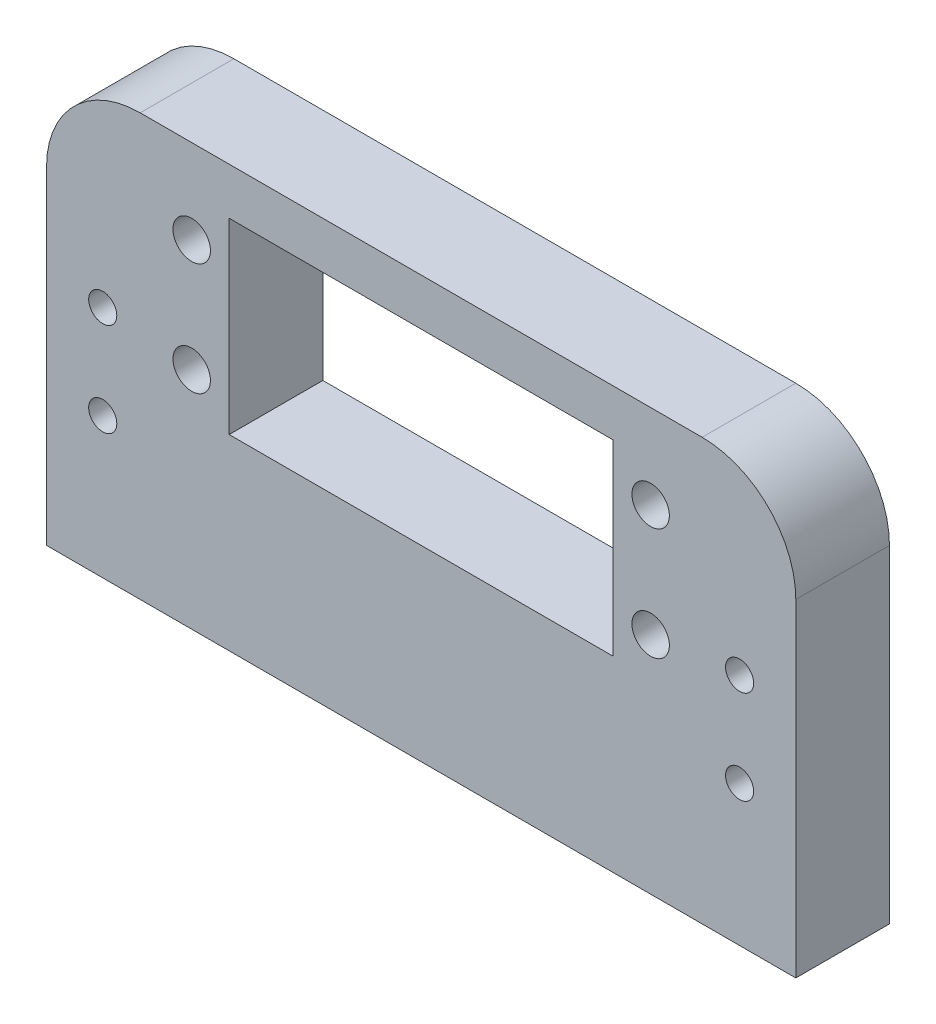
ISO-10303-21;
HEADER;
FILE_DESCRIPTION(('STEP AP214'),'2;1');
FILE_NAME('part.step','',(''),(''),'','','');
FILE_SCHEMA(('AUTOMOTIVE_DESIGN { 1 0 10303 214 1 1 1 1 }'));
ENDSEC;
DATA;
#1=APPLICATION_CONTEXT('core data for automotive mechanical design processes');
#2=APPLICATION_PROTOCOL_DEFINITION('international standard','automotive_design',2000,#1);
#3=PRODUCT_CONTEXT('',#1,'mechanical');
#4=PRODUCT('Part','Part','',(#3));
#5=PRODUCT_RELATED_PRODUCT_CATEGORY('part','',(#4));
#6=PRODUCT_DEFINITION_FORMATION('','',#4);
#7=PRODUCT_DEFINITION_CONTEXT('part definition',#1,'design');
#8=PRODUCT_DEFINITION('design','',#6,#7);
#9=PRODUCT_DEFINITION_SHAPE('','',#8);
#10=(LENGTH_UNIT() NAMED_UNIT(*) SI_UNIT(.MILLI.,.METRE.));
#11=(NAMED_UNIT(*) PLANE_ANGLE_UNIT() SI_UNIT($,.RADIAN.));
#12=(NAMED_UNIT(*) SI_UNIT($,.STERADIAN.) SOLID_ANGLE_UNIT());
#13=UNCERTAINTY_MEASURE_WITH_UNIT(LENGTH_MEASURE(1.E-05),#10,'distance_accuracy_value','');
#14=(GEOMETRIC_REPRESENTATION_CONTEXT(3) GLOBAL_UNCERTAINTY_ASSIGNED_CONTEXT((#13)) GLOBAL_UNIT_ASSIGNED_CONTEXT((#10,
#11,#12)) REPRESENTATION_CONTEXT('',''));
#15=CARTESIAN_POINT('',(0.,0.,0.));
#16=DIRECTION('',(0.,0.,1.));
#17=DIRECTION('',(1.,0.,0.));
#18=AXIS2_PLACEMENT_3D('',#15,#16,#17);
#19=CARTESIAN_POINT('',(-15.5364806866953,19.5708154506438,10.));
#20=DIRECTION('',(0.,0.,1.));
#21=DIRECTION('',(1.,0.,0.));
#22=AXIS2_PLACEMENT_3D('',#19,#20,#21);
#23=PLANE('',#22);
#24=CARTESIAN_POINT('',(48.4635193133047,9.57081545064378,10.));
#25=DIRECTION('',(0.,0.,1.));
#26=DIRECTION('',(-1.,0.,0.));
#27=AXIS2_PLACEMENT_3D('',#24,#25,#26);
#28=CIRCLE('',#27,1.5);
#29=CARTESIAN_POINT('',(46.9635193133047,9.57081545064378,10.));
#30=VERTEX_POINT('',#29);
#31=EDGE_CURVE('E288',#30,#30,#28,.T.);
#32=ORIENTED_EDGE('',*,*,#31,.F.);
#33=EDGE_LOOP('',(#32));
#34=FACE_BOUND('',#33,.T.);
#35=CARTESIAN_POINT('',(-19.5364806866953,-0.429184549356233,10.));
#36=DIRECTION('',(0.,0.,1.));
#37=DIRECTION('',(1.,0.,0.));
#38=AXIS2_PLACEMENT_3D('',#35,#36,#37);
#39=CIRCLE('',#38,1.5);
#40=CARTESIAN_POINT('',(-18.0364806866953,-0.429184549356233,10.));
#41=VERTEX_POINT('',#40);
#42=EDGE_CURVE('E300',#41,#41,#39,.T.);
#43=ORIENTED_EDGE('',*,*,#42,.F.);
#44=EDGE_LOOP('',(#43));
#45=FACE_BOUND('',#44,.T.);
#46=CARTESIAN_POINT('',(-10.0364806866953,8.57081545064376,10.));
#47=DIRECTION('',(0.,0.,1.));
#48=DIRECTION('',(-1.,0.,0.));
#49=AXIS2_PLACEMENT_3D('',#46,#47,#48);
#50=CIRCLE('',#49,2.);
#51=CARTESIAN_POINT('',(-12.0364806866953,8.57081545064376,10.));
#52=VERTEX_POINT('',#51);
#53=EDGE_CURVE('E312',#52,#52,#50,.T.);
#54=ORIENTED_EDGE('',*,*,#53,.F.);
#55=EDGE_LOOP('',(#54));
#56=FACE_BOUND('',#55,.T.);
#57=CARTESIAN_POINT('',(-10.0364806866953,20.5708154506438,10.));
#58=DIRECTION('',(0.,0.,1.));
#59=DIRECTION('',(1.,0.,0.));
#60=AXIS2_PLACEMENT_3D('',#57,#58,#59);
#61=CIRCLE('',#60,2.);
#62=CARTESIAN_POINT('',(-8.03648068669527,20.5708154506438,10.));
#63=VERTEX_POINT('',#62);
#64=EDGE_CURVE('E138',#63,#63,#61,.T.);
#65=ORIENTED_EDGE('',*,*,#64,.F.);
#66=EDGE_LOOP('',(#65));
#67=FACE_BOUND('',#66,.T.);
#68=DIRECTION('',(0.,1.,0.));
#69=VECTOR('',#68,1.);
#70=CARTESIAN_POINT('',(54.4635193133047,19.5708154506437,10.));
#71=LINE('',#70,#69);
#72=CARTESIAN_POINT('',(54.4635193133047,-15.4291845493562,10.));
#73=VERTEX_POINT('',#72);
#74=CARTESIAN_POINT('',(54.4635193133047,19.5708154506437,10.));
#75=VERTEX_POINT('',#74);
#76=EDGE_CURVE('E148',#73,#75,#71,.T.);
#77=ORIENTED_EDGE('',*,*,#76,.T.);
#78=CARTESIAN_POINT('',(44.4635193133047,19.5708154506438,10.));
#79=DIRECTION('',(0.,0.,1.));
#80=DIRECTION('',(1.,0.,0.));
#81=AXIS2_PLACEMENT_3D('',#78,#79,#80);
#82=CIRCLE('',#81,10.);
#83=CARTESIAN_POINT('',(44.4635193133047,29.5708154506438,10.));
#84=VERTEX_POINT('',#83);
#85=EDGE_CURVE('E151',#75,#84,#82,.T.);
#86=ORIENTED_EDGE('',*,*,#85,.T.);
#87=DIRECTION('',(-1.,0.,0.));
#88=VECTOR('',#87,1.);
#89=CARTESIAN_POINT('',(-15.5364806866952,29.5708154506438,10.));
#90=LINE('',#89,#88);
#91=CARTESIAN_POINT('',(-15.5364806866952,29.5708154506438,10.));
#92=VERTEX_POINT('',#91);
#93=EDGE_CURVE('E154',#84,#92,#90,.T.);
#94=ORIENTED_EDGE('',*,*,#93,.T.);
#95=CARTESIAN_POINT('',(-15.5364806866953,19.5708154506438,10.));
#96=DIRECTION('',(0.,0.,1.));
#97=DIRECTION('',(1.,0.,0.));
#98=AXIS2_PLACEMENT_3D('',#95,#96,#97);
#99=CIRCLE('',#98,10.);
#100=CARTESIAN_POINT('',(-25.5364806866953,19.5708154506437,10.));
#101=VERTEX_POINT('',#100);
#102=EDGE_CURVE('E156',#92,#101,#99,.T.);
#103=ORIENTED_EDGE('',*,*,#102,.T.);
#104=DIRECTION('',(0.,-1.,0.));
#105=VECTOR('',#104,1.);
#106=CARTESIAN_POINT('',(-25.5364806866953,19.5708154506437,10.));
#107=LINE('',#106,#105);
#108=CARTESIAN_POINT('',(-25.5364806866953,-15.4291845493562,10.));
#109=VERTEX_POINT('',#108);
#110=EDGE_CURVE('E158',#101,#109,#107,.T.);
#111=ORIENTED_EDGE('',*,*,#110,.T.);
#112=DIRECTION('',(1.,0.,0.));
#113=VECTOR('',#112,1.);
#114=CARTESIAN_POINT('',(-25.5364806866953,-15.4291845493562,10.));
#115=LINE('',#114,#113);
#116=EDGE_CURVE('E160',#109,#73,#115,.T.);
#117=ORIENTED_EDGE('',*,*,#116,.T.);
#118=EDGE_LOOP('',(#77,#86,#94,#103,#111,#117));
#119=FACE_BOUND('',#118,.T.);
#120=DIRECTION('',(1.,0.,0.));
#121=VECTOR('',#120,1.);
#122=CARTESIAN_POINT('',(-6.03648068669527,4.57081545064377,10.));
#123=LINE('',#122,#121);
#124=CARTESIAN_POINT('',(-6.03648068669527,4.57081545064377,10.));
#125=VERTEX_POINT('',#124);
#126=CARTESIAN_POINT('',(34.9635193133047,4.57081545064377,10.));
#127=VERTEX_POINT('',#126);
#128=EDGE_CURVE('E117',#125,#127,#123,.T.);
#129=ORIENTED_EDGE('',*,*,#128,.F.);
#130=DIRECTION('',(0.,-1.,0.));
#131=VECTOR('',#130,1.);
#132=CARTESIAN_POINT('',(-6.03648068669527,24.5708154506438,10.));
#133=LINE('',#132,#131);
#134=CARTESIAN_POINT('',(-6.03648068669527,24.5708154506438,10.));
#135=VERTEX_POINT('',#134);
#136=EDGE_CURVE('E109',#135,#125,#133,.T.);
#137=ORIENTED_EDGE('',*,*,#136,.F.);
#138=DIRECTION('',(-1.,0.,0.));
#139=VECTOR('',#138,1.);
#140=CARTESIAN_POINT('',(-6.03648068669527,24.5708154506438,10.));
#141=LINE('',#140,#139);
#142=CARTESIAN_POINT('',(34.9635193133047,24.5708154506438,10.));
#143=VERTEX_POINT('',#142);
#144=EDGE_CURVE('E132',#143,#135,#141,.T.);
#145=ORIENTED_EDGE('',*,*,#144,.F.);
#146=DIRECTION('',(0.,1.,0.));
#147=VECTOR('',#146,1.);
#148=CARTESIAN_POINT('',(34.9635193133047,24.5708154506438,10.));
#149=LINE('',#148,#147);
#150=EDGE_CURVE('E130',#127,#143,#149,.T.);
#151=ORIENTED_EDGE('',*,*,#150,.F.);
#152=EDGE_LOOP('',(#129,#137,#145,#151));
#153=FACE_BOUND('',#152,.T.);
#154=CARTESIAN_POINT('',(38.9635193133047,8.57081545064376,10.));
#155=DIRECTION('',(0.,0.,1.));
#156=DIRECTION('',(1.,0.,0.));
#157=AXIS2_PLACEMENT_3D('',#154,#155,#156);
#158=CIRCLE('',#157,2.);
#159=CARTESIAN_POINT('',(40.9635193133047,8.57081545064376,10.));
#160=VERTEX_POINT('',#159);
#161=EDGE_CURVE('E318',#160,#160,#158,.T.);
#162=ORIENTED_EDGE('',*,*,#161,.F.);
#163=EDGE_LOOP('',(#162));
#164=FACE_BOUND('',#163,.T.);
#165=CARTESIAN_POINT('',(38.9635193133047,20.5708154506438,10.));
#166=DIRECTION('',(0.,0.,1.));
#167=DIRECTION('',(-1.,0.,0.));
#168=AXIS2_PLACEMENT_3D('',#165,#166,#167);
#169=CIRCLE('',#168,2.);
#170=CARTESIAN_POINT('',(36.9635193133048,20.5708154506438,10.));
#171=VERTEX_POINT('',#170);
#172=EDGE_CURVE('E306',#171,#171,#169,.T.);
#173=ORIENTED_EDGE('',*,*,#172,.F.);
#174=EDGE_LOOP('',(#173));
#175=FACE_BOUND('',#174,.T.);
#176=CARTESIAN_POINT('',(-19.5364806866953,9.57081545064377,10.));
#177=DIRECTION('',(0.,0.,1.));
#178=DIRECTION('',(1.,0.,0.));
#179=AXIS2_PLACEMENT_3D('',#176,#177,#178);
#180=CIRCLE('',#179,1.5);
#181=CARTESIAN_POINT('',(-18.0364806866953,9.57081545064377,10.));
#182=VERTEX_POINT('',#181);
#183=EDGE_CURVE('E294',#182,#182,#180,.T.);
#184=ORIENTED_EDGE('',*,*,#183,.F.);
#185=EDGE_LOOP('',(#184));
#186=FACE_BOUND('',#185,.T.);
#187=CARTESIAN_POINT('',(48.4635193133048,-0.429184549356225,10.));
#188=DIRECTION('',(0.,0.,1.));
#189=DIRECTION('',(-1.,0.,0.));
#190=AXIS2_PLACEMENT_3D('',#187,#188,#189);
#191=CIRCLE('',#190,1.5);
#192=CARTESIAN_POINT('',(46.9635193133048,-0.429184549356225,10.));
#193=VERTEX_POINT('',#192);
#194=EDGE_CURVE('E279',#193,#193,#191,.T.);
#195=ORIENTED_EDGE('',*,*,#194,.F.);
#196=EDGE_LOOP('',(#195));
#197=FACE_BOUND('',#196,.T.);
#198=ADVANCED_FACE('F32',(#34,#45,#56,#67,#119,#153,#164,#175,#186,#197),#23,.T.);
#199=CARTESIAN_POINT('',(-15.5364806866953,19.5708154506438,0.));
#200=DIRECTION('',(0.,0.,1.));
#201=DIRECTION('',(1.,0.,0.));
#202=AXIS2_PLACEMENT_3D('',#199,#200,#201);
#203=PLANE('',#202);
#204=DIRECTION('',(0.,1.,0.));
#205=VECTOR('',#204,1.);
#206=CARTESIAN_POINT('',(54.4635193133047,19.5708154506437,0.));
#207=LINE('',#206,#205);
#208=CARTESIAN_POINT('',(54.4635193133047,-15.4291845493562,0.));
#209=VERTEX_POINT('',#208);
#210=CARTESIAN_POINT('',(54.4635193133047,19.5708154506437,0.));
#211=VERTEX_POINT('',#210);
#212=EDGE_CURVE('E125',#209,#211,#207,.T.);
#213=ORIENTED_EDGE('',*,*,#212,.F.);
#214=DIRECTION('',(1.,0.,0.));
#215=VECTOR('',#214,1.);
#216=CARTESIAN_POINT('',(-25.5364806866953,-15.4291845493562,0.));
#217=LINE('',#216,#215);
#218=CARTESIAN_POINT('',(-25.5364806866953,-15.4291845493562,0.));
#219=VERTEX_POINT('',#218);
#220=EDGE_CURVE('E152',#219,#209,#217,.T.);
#221=ORIENTED_EDGE('',*,*,#220,.F.);
#222=DIRECTION('',(0.,-1.,0.));
#223=VECTOR('',#222,1.);
#224=CARTESIAN_POINT('',(-25.5364806866953,19.5708154506437,0.));
#225=LINE('',#224,#223);
#226=CARTESIAN_POINT('',(-25.5364806866953,19.5708154506437,0.));
#227=VERTEX_POINT('',#226);
#228=EDGE_CURVE('E171',#227,#219,#225,.T.);
#229=ORIENTED_EDGE('',*,*,#228,.F.);
#230=CARTESIAN_POINT('',(-15.5364806866953,19.5708154506438,0.));
#231=DIRECTION('',(0.,0.,1.));
#232=DIRECTION('',(1.,0.,0.));
#233=AXIS2_PLACEMENT_3D('',#230,#231,#232);
#234=CIRCLE('',#233,10.);
#235=CARTESIAN_POINT('',(-15.5364806866952,29.5708154506438,0.));
#236=VERTEX_POINT('',#235);
#237=EDGE_CURVE('E169',#236,#227,#234,.T.);
#238=ORIENTED_EDGE('',*,*,#237,.F.);
#239=DIRECTION('',(-1.,0.,0.));
#240=VECTOR('',#239,1.);
#241=CARTESIAN_POINT('',(-15.5364806866952,29.5708154506438,0.));
#242=LINE('',#241,#240);
#243=CARTESIAN_POINT('',(44.4635193133047,29.5708154506438,0.));
#244=VERTEX_POINT('',#243);
#245=EDGE_CURVE('E167',#244,#236,#242,.T.);
#246=ORIENTED_EDGE('',*,*,#245,.F.);
#247=CARTESIAN_POINT('',(44.4635193133047,19.5708154506438,0.));
#248=DIRECTION('',(0.,0.,1.));
#249=DIRECTION('',(1.,0.,0.));
#250=AXIS2_PLACEMENT_3D('',#247,#248,#249);
#251=CIRCLE('',#250,10.);
#252=EDGE_CURVE('E165',#211,#244,#251,.T.);
#253=ORIENTED_EDGE('',*,*,#252,.F.);
#254=EDGE_LOOP('',(#213,#221,#229,#238,#246,#253));
#255=FACE_BOUND('',#254,.T.);
#256=DIRECTION('',(0.,-1.,0.));
#257=VECTOR('',#256,1.);
#258=CARTESIAN_POINT('',(-6.03648068669527,24.5708154506438,0.));
#259=LINE('',#258,#257);
#260=CARTESIAN_POINT('',(-6.03648068669527,24.5708154506438,0.));
#261=VERTEX_POINT('',#260);
#262=CARTESIAN_POINT('',(-6.03648068669527,4.57081545064377,0.));
#263=VERTEX_POINT('',#262);
#264=EDGE_CURVE('E55',#261,#263,#259,.T.);
#265=ORIENTED_EDGE('',*,*,#264,.T.);
#266=DIRECTION('',(1.,0.,0.));
#267=VECTOR('',#266,1.);
#268=CARTESIAN_POINT('',(-6.03648068669527,4.57081545064377,0.));
#269=LINE('',#268,#267);
#270=CARTESIAN_POINT('',(34.9635193133047,4.57081545064377,0.));
#271=VERTEX_POINT('',#270);
#272=EDGE_CURVE('E124',#263,#271,#269,.T.);
#273=ORIENTED_EDGE('',*,*,#272,.T.);
#274=DIRECTION('',(0.,1.,0.));
#275=VECTOR('',#274,1.);
#276=CARTESIAN_POINT('',(34.9635193133047,24.5708154506438,0.));
#277=LINE('',#276,#275);
#278=CARTESIAN_POINT('',(34.9635193133047,24.5708154506438,0.));
#279=VERTEX_POINT('',#278);
#280=EDGE_CURVE('E140',#271,#279,#277,.T.);
#281=ORIENTED_EDGE('',*,*,#280,.T.);
#282=DIRECTION('',(-1.,0.,0.));
#283=VECTOR('',#282,1.);
#284=CARTESIAN_POINT('',(-6.03648068669527,24.5708154506438,0.));
#285=LINE('',#284,#283);
#286=EDGE_CURVE('E118',#279,#261,#285,.T.);
#287=ORIENTED_EDGE('',*,*,#286,.T.);
#288=EDGE_LOOP('',(#265,#273,#281,#287));
#289=FACE_BOUND('',#288,.T.);
#290=CARTESIAN_POINT('',(-10.0364806866953,20.5708154506438,0.));
#291=DIRECTION('',(0.,0.,1.));
#292=DIRECTION('',(1.,0.,0.));
#293=AXIS2_PLACEMENT_3D('',#290,#291,#292);
#294=CIRCLE('',#293,2.);
#295=CARTESIAN_POINT('',(-8.03648068669527,20.5708154506438,0.));
#296=VERTEX_POINT('',#295);
#297=EDGE_CURVE('E321',#296,#296,#294,.T.);
#298=ORIENTED_EDGE('',*,*,#297,.T.);
#299=EDGE_LOOP('',(#298));
#300=FACE_BOUND('',#299,.T.);
#301=CARTESIAN_POINT('',(38.9635193133047,8.57081545064376,0.));
#302=DIRECTION('',(0.,0.,1.));
#303=DIRECTION('',(1.,0.,0.));
#304=AXIS2_PLACEMENT_3D('',#301,#302,#303);
#305=CIRCLE('',#304,2.);
#306=CARTESIAN_POINT('',(40.9635193133047,8.57081545064376,0.));
#307=VERTEX_POINT('',#306);
#308=EDGE_CURVE('E315',#307,#307,#305,.T.);
#309=ORIENTED_EDGE('',*,*,#308,.T.);
#310=EDGE_LOOP('',(#309));
#311=FACE_BOUND('',#310,.T.);
#312=CARTESIAN_POINT('',(-10.0364806866953,8.57081545064376,0.));
#313=DIRECTION('',(0.,0.,1.));
#314=DIRECTION('',(-1.,0.,0.));
#315=AXIS2_PLACEMENT_3D('',#312,#313,#314);
#316=CIRCLE('',#315,2.);
#317=CARTESIAN_POINT('',(-12.0364806866953,8.57081545064376,0.));
#318=VERTEX_POINT('',#317);
#319=EDGE_CURVE('E309',#318,#318,#316,.T.);
#320=ORIENTED_EDGE('',*,*,#319,.T.);
#321=EDGE_LOOP('',(#320));
#322=FACE_BOUND('',#321,.T.);
#323=CARTESIAN_POINT('',(38.9635193133047,20.5708154506438,0.));
#324=DIRECTION('',(0.,0.,1.));
#325=DIRECTION('',(-1.,0.,0.));
#326=AXIS2_PLACEMENT_3D('',#323,#324,#325);
#327=CIRCLE('',#326,2.);
#328=CARTESIAN_POINT('',(36.9635193133048,20.5708154506438,0.));
#329=VERTEX_POINT('',#328);
#330=EDGE_CURVE('E303',#329,#329,#327,.T.);
#331=ORIENTED_EDGE('',*,*,#330,.T.);
#332=EDGE_LOOP('',(#331));
#333=FACE_BOUND('',#332,.T.);
#334=CARTESIAN_POINT('',(-19.5364806866953,-0.429184549356233,0.));
#335=DIRECTION('',(0.,0.,1.));
#336=DIRECTION('',(1.,0.,0.));
#337=AXIS2_PLACEMENT_3D('',#334,#335,#336);
#338=CIRCLE('',#337,1.5);
#339=CARTESIAN_POINT('',(-18.0364806866953,-0.429184549356233,0.));
#340=VERTEX_POINT('',#339);
#341=EDGE_CURVE('E297',#340,#340,#338,.T.);
#342=ORIENTED_EDGE('',*,*,#341,.T.);
#343=EDGE_LOOP('',(#342));
#344=FACE_BOUND('',#343,.T.);
#345=CARTESIAN_POINT('',(-19.5364806866953,9.57081545064377,0.));
#346=DIRECTION('',(0.,0.,1.));
#347=DIRECTION('',(1.,0.,0.));
#348=AXIS2_PLACEMENT_3D('',#345,#346,#347);
#349=CIRCLE('',#348,1.5);
#350=CARTESIAN_POINT('',(-18.0364806866953,9.57081545064377,0.));
#351=VERTEX_POINT('',#350);
#352=EDGE_CURVE('E291',#351,#351,#349,.T.);
#353=ORIENTED_EDGE('',*,*,#352,.T.);
#354=EDGE_LOOP('',(#353));
#355=FACE_BOUND('',#354,.T.);
#356=CARTESIAN_POINT('',(48.4635193133047,9.57081545064378,0.));
#357=DIRECTION('',(0.,0.,1.));
#358=DIRECTION('',(-1.,0.,0.));
#359=AXIS2_PLACEMENT_3D('',#356,#357,#358);
#360=CIRCLE('',#359,1.5);
#361=CARTESIAN_POINT('',(46.9635193133047,9.57081545064378,0.));
#362=VERTEX_POINT('',#361);
#363=EDGE_CURVE('E285',#362,#362,#360,.T.);
#364=ORIENTED_EDGE('',*,*,#363,.T.);
#365=EDGE_LOOP('',(#364));
#366=FACE_BOUND('',#365,.T.);
#367=CARTESIAN_POINT('',(48.4635193133048,-0.429184549356225,0.));
#368=DIRECTION('',(0.,0.,1.));
#369=DIRECTION('',(-1.,0.,0.));
#370=AXIS2_PLACEMENT_3D('',#367,#368,#369);
#371=CIRCLE('',#370,1.5);
#372=CARTESIAN_POINT('',(46.9635193133048,-0.429184549356225,0.));
#373=VERTEX_POINT('',#372);
#374=EDGE_CURVE('E282',#373,#373,#371,.T.);
#375=ORIENTED_EDGE('',*,*,#374,.T.);
#376=EDGE_LOOP('',(#375));
#377=FACE_BOUND('',#376,.T.);
#378=ADVANCED_FACE('F195',(#255,#289,#300,#311,#322,#333,#344,#355,#366,#377),#203,.F.);
#379=CARTESIAN_POINT('',(54.4635193133047,19.5708154506437,10.));
#380=DIRECTION('',(-1.,0.,0.));
#381=DIRECTION('',(0.,-1.,0.));
#382=AXIS2_PLACEMENT_3D('',#379,#380,#381);
#383=PLANE('',#382);
#384=ORIENTED_EDGE('',*,*,#212,.T.);
#385=DIRECTION('',(0.,0.,-1.));
#386=VECTOR('',#385,1.);
#387=CARTESIAN_POINT('',(54.4635193133047,19.5708154506437,10.));
#388=LINE('',#387,#386);
#389=EDGE_CURVE('E11',#75,#211,#388,.T.);
#390=ORIENTED_EDGE('',*,*,#389,.F.);
#391=ORIENTED_EDGE('',*,*,#76,.F.);
#392=DIRECTION('',(0.,0.,-1.));
#393=VECTOR('',#392,1.);
#394=CARTESIAN_POINT('',(54.4635193133047,-15.4291845493562,10.));
#395=LINE('',#394,#393);
#396=EDGE_CURVE('E162',#73,#209,#395,.T.);
#397=ORIENTED_EDGE('',*,*,#396,.T.);
#398=EDGE_LOOP('',(#384,#390,#391,#397));
#399=FACE_BOUND('',#398,.T.);
#400=ADVANCED_FACE('F34',(#399),#383,.F.);
#401=CARTESIAN_POINT('',(44.4635193133047,19.5708154506438,10.));
#402=DIRECTION('',(0.,0.,-1.));
#403=DIRECTION('',(-1.,0.,0.));
#404=AXIS2_PLACEMENT_3D('',#401,#402,#403);
#405=CYLINDRICAL_SURFACE('',#404,10.);
#406=ORIENTED_EDGE('',*,*,#252,.T.);
#407=DIRECTION('',(0.,0.,-1.));
#408=VECTOR('',#407,1.);
#409=CARTESIAN_POINT('',(44.4635193133047,29.5708154506438,10.));
#410=LINE('',#409,#408);
#411=EDGE_CURVE('E40',#84,#244,#410,.T.);
#412=ORIENTED_EDGE('',*,*,#411,.F.);
#413=ORIENTED_EDGE('',*,*,#85,.F.);
#414=ORIENTED_EDGE('',*,*,#389,.T.);
#415=EDGE_LOOP('',(#406,#412,#413,#414));
#416=FACE_BOUND('',#415,.T.);
#417=ADVANCED_FACE('F212',(#416),#405,.T.);
#418=CARTESIAN_POINT('',(-15.5364806866952,29.5708154506438,10.));
#419=DIRECTION('',(0.,-1.,0.));
#420=DIRECTION('',(1.,0.,0.));
#421=AXIS2_PLACEMENT_3D('',#418,#419,#420);
#422=PLANE('',#421);
#423=ORIENTED_EDGE('',*,*,#245,.T.);
#424=DIRECTION('',(0.,0.,-1.));
#425=VECTOR('',#424,1.);
#426=CARTESIAN_POINT('',(-15.5364806866952,29.5708154506438,10.));
#427=LINE('',#426,#425);
#428=EDGE_CURVE('E182',#92,#236,#427,.T.);
#429=ORIENTED_EDGE('',*,*,#428,.F.);
#430=ORIENTED_EDGE('',*,*,#93,.F.);
#431=ORIENTED_EDGE('',*,*,#411,.T.);
#432=EDGE_LOOP('',(#423,#429,#430,#431));
#433=FACE_BOUND('',#432,.T.);
#434=ADVANCED_FACE('F189',(#433),#422,.F.);
#435=CARTESIAN_POINT('',(-15.5364806866953,19.5708154506438,10.));
#436=DIRECTION('',(0.,0.,-1.));
#437=DIRECTION('',(-1.,0.,0.));
#438=AXIS2_PLACEMENT_3D('',#435,#436,#437);
#439=CYLINDRICAL_SURFACE('',#438,10.);
#440=ORIENTED_EDGE('',*,*,#237,.T.);
#441=DIRECTION('',(0.,0.,-1.));
#442=VECTOR('',#441,1.);
#443=CARTESIAN_POINT('',(-25.5364806866953,19.5708154506437,10.));
#444=LINE('',#443,#442);
#445=EDGE_CURVE('E179',#101,#227,#444,.T.);
#446=ORIENTED_EDGE('',*,*,#445,.F.);
#447=ORIENTED_EDGE('',*,*,#102,.F.);
#448=ORIENTED_EDGE('',*,*,#428,.T.);
#449=EDGE_LOOP('',(#440,#446,#447,#448));
#450=FACE_BOUND('',#449,.T.);
#451=ADVANCED_FACE('F201',(#450),#439,.T.);
#452=CARTESIAN_POINT('',(-25.5364806866953,19.5708154506437,10.));
#453=DIRECTION('',(1.,0.,0.));
#454=DIRECTION('',(0.,0.,-1.));
#455=AXIS2_PLACEMENT_3D('',#452,#453,#454);
#456=PLANE('',#455);
#457=ORIENTED_EDGE('',*,*,#228,.T.);
#458=DIRECTION('',(0.,0.,-1.));
#459=VECTOR('',#458,1.);
#460=CARTESIAN_POINT('',(-25.5364806866953,-15.4291845493562,10.));
#461=LINE('',#460,#459);
#462=EDGE_CURVE('E176',#109,#219,#461,.T.);
#463=ORIENTED_EDGE('',*,*,#462,.F.);
#464=ORIENTED_EDGE('',*,*,#110,.F.);
#465=ORIENTED_EDGE('',*,*,#445,.T.);
#466=EDGE_LOOP('',(#457,#463,#464,#465));
#467=FACE_BOUND('',#466,.T.);
#468=ADVANCED_FACE('F205',(#467),#456,.F.);
#469=CARTESIAN_POINT('',(-25.5364806866953,-15.4291845493562,10.));
#470=DIRECTION('',(0.,1.,0.));
#471=DIRECTION('',(0.,0.,1.));
#472=AXIS2_PLACEMENT_3D('',#469,#470,#471);
#473=PLANE('',#472);
#474=ORIENTED_EDGE('',*,*,#220,.T.);
#475=ORIENTED_EDGE('',*,*,#396,.F.);
#476=ORIENTED_EDGE('',*,*,#116,.F.);
#477=ORIENTED_EDGE('',*,*,#462,.T.);
#478=EDGE_LOOP('',(#474,#475,#476,#477));
#479=FACE_BOUND('',#478,.T.);
#480=ADVANCED_FACE('F215',(#479),#473,.F.);
#481=CARTESIAN_POINT('',(-6.03648068669527,24.5708154506438,10.));
#482=DIRECTION('',(1.,0.,0.));
#483=DIRECTION('',(0.,1.,0.));
#484=AXIS2_PLACEMENT_3D('',#481,#482,#483);
#485=PLANE('',#484);
#486=ORIENTED_EDGE('',*,*,#264,.F.);
#487=DIRECTION('',(0.,0.,-1.));
#488=VECTOR('',#487,1.);
#489=CARTESIAN_POINT('',(-6.03648068669527,24.5708154506438,10.));
#490=LINE('',#489,#488);
#491=EDGE_CURVE('E113',#135,#261,#490,.T.);
#492=ORIENTED_EDGE('',*,*,#491,.F.);
#493=ORIENTED_EDGE('',*,*,#136,.T.);
#494=DIRECTION('',(0.,0.,-1.));
#495=VECTOR('',#494,1.);
#496=CARTESIAN_POINT('',(-6.03648068669527,4.57081545064377,10.));
#497=LINE('',#496,#495);
#498=EDGE_CURVE('E112',#125,#263,#497,.T.);
#499=ORIENTED_EDGE('',*,*,#498,.T.);
#500=EDGE_LOOP('',(#486,#492,#493,#499));
#501=FACE_BOUND('',#500,.T.);
#502=ADVANCED_FACE('F111',(#501),#485,.T.);
#503=CARTESIAN_POINT('',(-6.03648068669527,4.57081545064377,10.));
#504=DIRECTION('',(0.,1.,0.));
#505=DIRECTION('',(0.,0.,1.));
#506=AXIS2_PLACEMENT_3D('',#503,#504,#505);
#507=PLANE('',#506);
#508=ORIENTED_EDGE('',*,*,#272,.F.);
#509=ORIENTED_EDGE('',*,*,#498,.F.);
#510=ORIENTED_EDGE('',*,*,#128,.T.);
#511=DIRECTION('',(0.,0.,-1.));
#512=VECTOR('',#511,1.);
#513=CARTESIAN_POINT('',(34.9635193133047,4.57081545064377,10.));
#514=LINE('',#513,#512);
#515=EDGE_CURVE('E126',#127,#271,#514,.T.);
#516=ORIENTED_EDGE('',*,*,#515,.T.);
#517=EDGE_LOOP('',(#508,#509,#510,#516));
#518=FACE_BOUND('',#517,.T.);
#519=ADVANCED_FACE('F121',(#518),#507,.T.);
#520=CARTESIAN_POINT('',(34.9635193133047,24.5708154506438,10.));
#521=DIRECTION('',(-1.,0.,0.));
#522=DIRECTION('',(0.,0.,1.));
#523=AXIS2_PLACEMENT_3D('',#520,#521,#522);
#524=PLANE('',#523);
#525=ORIENTED_EDGE('',*,*,#280,.F.);
#526=ORIENTED_EDGE('',*,*,#515,.F.);
#527=ORIENTED_EDGE('',*,*,#150,.T.);
#528=DIRECTION('',(0.,0.,-1.));
#529=VECTOR('',#528,1.);
#530=CARTESIAN_POINT('',(34.9635193133047,24.5708154506438,10.));
#531=LINE('',#530,#529);
#532=EDGE_CURVE('E47',#143,#279,#531,.T.);
#533=ORIENTED_EDGE('',*,*,#532,.T.);
#534=EDGE_LOOP('',(#525,#526,#527,#533));
#535=FACE_BOUND('',#534,.T.);
#536=ADVANCED_FACE('F236',(#535),#524,.T.);
#537=CARTESIAN_POINT('',(-6.03648068669527,24.5708154506438,10.));
#538=DIRECTION('',(0.,-1.,0.));
#539=DIRECTION('',(0.,0.,-1.));
#540=AXIS2_PLACEMENT_3D('',#537,#538,#539);
#541=PLANE('',#540);
#542=ORIENTED_EDGE('',*,*,#286,.F.);
#543=ORIENTED_EDGE('',*,*,#532,.F.);
#544=ORIENTED_EDGE('',*,*,#144,.T.);
#545=ORIENTED_EDGE('',*,*,#491,.T.);
#546=EDGE_LOOP('',(#542,#543,#544,#545));
#547=FACE_BOUND('',#546,.T.);
#548=ADVANCED_FACE('F239',(#547),#541,.T.);
#549=CARTESIAN_POINT('',(-10.0364806866953,20.5708154506438,10.));
#550=DIRECTION('',(0.,0.,-1.));
#551=DIRECTION('',(-1.,0.,0.));
#552=AXIS2_PLACEMENT_3D('',#549,#550,#551);
#553=CYLINDRICAL_SURFACE('',#552,2.);
#554=ORIENTED_EDGE('',*,*,#64,.T.);
#555=EDGE_LOOP('',(#554));
#556=FACE_BOUND('',#555,.T.);
#557=ORIENTED_EDGE('',*,*,#297,.F.);
#558=EDGE_LOOP('',(#557));
#559=FACE_BOUND('',#558,.T.);
#560=ADVANCED_FACE('F243',(#556,#559),#553,.F.);
#561=CARTESIAN_POINT('',(38.9635193133047,8.57081545064376,10.));
#562=DIRECTION('',(0.,0.,-1.));
#563=DIRECTION('',(-1.,0.,0.));
#564=AXIS2_PLACEMENT_3D('',#561,#562,#563);
#565=CYLINDRICAL_SURFACE('',#564,2.);
#566=ORIENTED_EDGE('',*,*,#161,.T.);
#567=EDGE_LOOP('',(#566));
#568=FACE_BOUND('',#567,.T.);
#569=ORIENTED_EDGE('',*,*,#308,.F.);
#570=EDGE_LOOP('',(#569));
#571=FACE_BOUND('',#570,.T.);
#572=ADVANCED_FACE('F246',(#568,#571),#565,.F.);
#573=CARTESIAN_POINT('',(-10.0364806866953,8.57081545064376,10.));
#574=DIRECTION('',(0.,0.,-1.));
#575=DIRECTION('',(-1.,0.,0.));
#576=AXIS2_PLACEMENT_3D('',#573,#574,#575);
#577=CYLINDRICAL_SURFACE('',#576,2.);
#578=ORIENTED_EDGE('',*,*,#53,.T.);
#579=EDGE_LOOP('',(#578));
#580=FACE_BOUND('',#579,.T.);
#581=ORIENTED_EDGE('',*,*,#319,.F.);
#582=EDGE_LOOP('',(#581));
#583=FACE_BOUND('',#582,.T.);
#584=ADVANCED_FACE('F250',(#580,#583),#577,.F.);
#585=CARTESIAN_POINT('',(38.9635193133047,20.5708154506438,10.));
#586=DIRECTION('',(0.,0.,-1.));
#587=DIRECTION('',(-1.,0.,0.));
#588=AXIS2_PLACEMENT_3D('',#585,#586,#587);
#589=CYLINDRICAL_SURFACE('',#588,2.);
#590=ORIENTED_EDGE('',*,*,#172,.T.);
#591=EDGE_LOOP('',(#590));
#592=FACE_BOUND('',#591,.T.);
#593=ORIENTED_EDGE('',*,*,#330,.F.);
#594=EDGE_LOOP('',(#593));
#595=FACE_BOUND('',#594,.T.);
#596=ADVANCED_FACE('F254',(#592,#595),#589,.F.);
#597=CARTESIAN_POINT('',(-19.5364806866953,-0.429184549356233,10.));
#598=DIRECTION('',(0.,0.,-1.));
#599=DIRECTION('',(-1.,0.,0.));
#600=AXIS2_PLACEMENT_3D('',#597,#598,#599);
#601=CYLINDRICAL_SURFACE('',#600,1.5);
#602=ORIENTED_EDGE('',*,*,#42,.T.);
#603=EDGE_LOOP('',(#602));
#604=FACE_BOUND('',#603,.T.);
#605=ORIENTED_EDGE('',*,*,#341,.F.);
#606=EDGE_LOOP('',(#605));
#607=FACE_BOUND('',#606,.T.);
#608=ADVANCED_FACE('F258',(#604,#607),#601,.F.);
#609=CARTESIAN_POINT('',(-19.5364806866953,9.57081545064377,10.));
#610=DIRECTION('',(0.,0.,-1.));
#611=DIRECTION('',(-1.,0.,0.));
#612=AXIS2_PLACEMENT_3D('',#609,#610,#611);
#613=CYLINDRICAL_SURFACE('',#612,1.5);
#614=ORIENTED_EDGE('',*,*,#183,.T.);
#615=EDGE_LOOP('',(#614));
#616=FACE_BOUND('',#615,.T.);
#617=ORIENTED_EDGE('',*,*,#352,.F.);
#618=EDGE_LOOP('',(#617));
#619=FACE_BOUND('',#618,.T.);
#620=ADVANCED_FACE('F262',(#616,#619),#613,.F.);
#621=CARTESIAN_POINT('',(48.4635193133047,9.57081545064378,10.));
#622=DIRECTION('',(0.,0.,-1.));
#623=DIRECTION('',(-1.,0.,0.));
#624=AXIS2_PLACEMENT_3D('',#621,#622,#623);
#625=CYLINDRICAL_SURFACE('',#624,1.5);
#626=ORIENTED_EDGE('',*,*,#31,.T.);
#627=EDGE_LOOP('',(#626));
#628=FACE_BOUND('',#627,.T.);
#629=ORIENTED_EDGE('',*,*,#363,.F.);
#630=EDGE_LOOP('',(#629));
#631=FACE_BOUND('',#630,.T.);
#632=ADVANCED_FACE('F266',(#628,#631),#625,.F.);
#633=CARTESIAN_POINT('',(48.4635193133048,-0.429184549356225,10.));
#634=DIRECTION('',(0.,0.,-1.));
#635=DIRECTION('',(-1.,0.,0.));
#636=AXIS2_PLACEMENT_3D('',#633,#634,#635);
#637=CYLINDRICAL_SURFACE('',#636,1.5);
#638=ORIENTED_EDGE('',*,*,#194,.T.);
#639=EDGE_LOOP('',(#638));
#640=FACE_BOUND('',#639,.T.);
#641=ORIENTED_EDGE('',*,*,#374,.F.);
#642=EDGE_LOOP('',(#641));
#643=FACE_BOUND('',#642,.T.);
#644=ADVANCED_FACE('F270',(#640,#643),#637,.F.);
#645=CLOSED_SHELL('',(#198,#378,#400,#417,#434,#451,#468,#480,#502,#519,#536,#548,#560,#572,
#584,#596,#608,#620,#632,#644));
#646=MANIFOLD_SOLID_BREP('B2',#645);
#647=ADVANCED_BREP_SHAPE_REPRESENTATION('',(#18,#646),#14);
#648=SHAPE_DEFINITION_REPRESENTATION(#9,#647);
ENDSEC;
END-ISO-10303-21;
